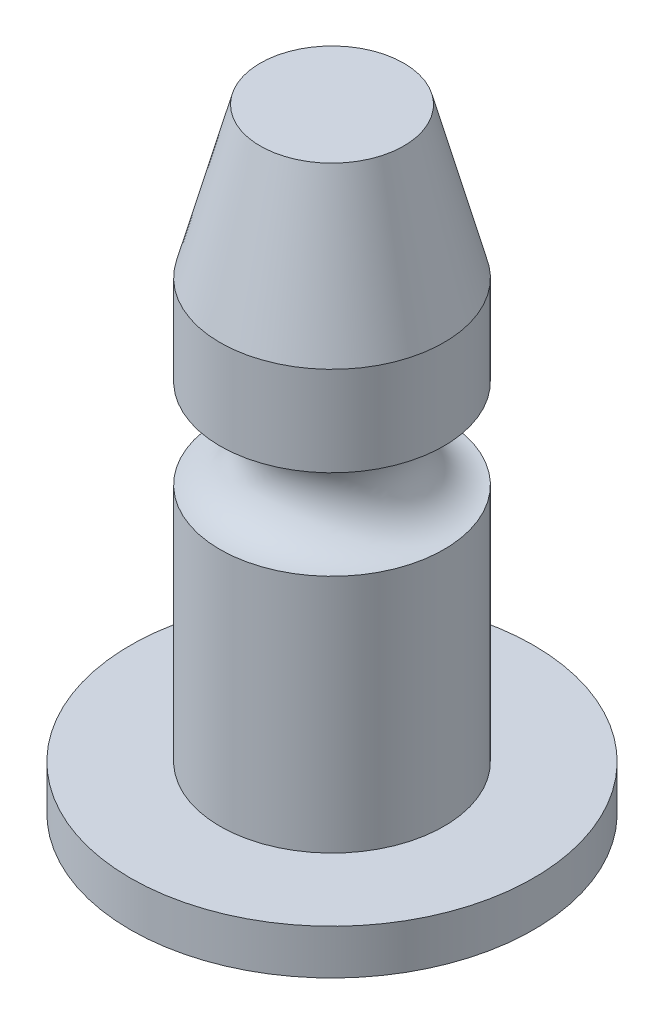
ISO-10303-21;
HEADER;
FILE_DESCRIPTION(('STEP AP214'),'2;1');
FILE_NAME('part.step','',(''),(''),'','','');
FILE_SCHEMA(('AUTOMOTIVE_DESIGN { 1 0 10303 214 1 1 1 1 }'));
ENDSEC;
DATA;
#1=APPLICATION_CONTEXT('core data for automotive mechanical design processes');
#2=APPLICATION_PROTOCOL_DEFINITION('international standard','automotive_design',2000,#1);
#3=PRODUCT_CONTEXT('',#1,'mechanical');
#4=PRODUCT('Part','Part','',(#3));
#5=PRODUCT_RELATED_PRODUCT_CATEGORY('part','',(#4));
#6=PRODUCT_DEFINITION_FORMATION('','',#4);
#7=PRODUCT_DEFINITION_CONTEXT('part definition',#1,'design');
#8=PRODUCT_DEFINITION('design','',#6,#7);
#9=PRODUCT_DEFINITION_SHAPE('','',#8);
#10=(LENGTH_UNIT() NAMED_UNIT(*) SI_UNIT(.MILLI.,.METRE.));
#11=(NAMED_UNIT(*) PLANE_ANGLE_UNIT() SI_UNIT($,.RADIAN.));
#12=(NAMED_UNIT(*) SI_UNIT($,.STERADIAN.) SOLID_ANGLE_UNIT());
#13=UNCERTAINTY_MEASURE_WITH_UNIT(LENGTH_MEASURE(1.E-05),#10,'distance_accuracy_value','');
#14=(GEOMETRIC_REPRESENTATION_CONTEXT(3) GLOBAL_UNCERTAINTY_ASSIGNED_CONTEXT((#13)) GLOBAL_UNIT_ASSIGNED_CONTEXT((#10,
#11,#12)) REPRESENTATION_CONTEXT('',''));
#15=CARTESIAN_POINT('',(0.,0.,0.));
#16=DIRECTION('',(0.,0.,1.));
#17=DIRECTION('',(1.,0.,0.));
#18=AXIS2_PLACEMENT_3D('',#15,#16,#17);
#19=CARTESIAN_POINT('',(-4.5,-7.35,0.));
#20=DIRECTION('',(0.,1.,0.));
#21=DIRECTION('',(0.,0.,1.));
#22=AXIS2_PLACEMENT_3D('',#19,#20,#21);
#23=PLANE('',#22);
#24=CARTESIAN_POINT('',(0.,-7.35,0.));
#25=DIRECTION('',(0.,-1.,0.));
#26=DIRECTION('',(0.,0.,-1.));
#27=AXIS2_PLACEMENT_3D('',#24,#25,#26);
#28=CIRCLE('',#27,4.5);
#29=CARTESIAN_POINT('',(0.,-7.35,-4.5));
#30=VERTEX_POINT('',#29);
#31=EDGE_CURVE('E10',#30,#30,#28,.T.);
#32=ORIENTED_EDGE('',*,*,#31,.T.);
#33=EDGE_LOOP('',(#32));
#34=FACE_BOUND('',#33,.T.);
#35=ADVANCED_FACE('F37',(#34),#23,.F.);
#36=CARTESIAN_POINT('',(0.,0.,0.));
#37=DIRECTION('',(0.,-1.,0.));
#38=DIRECTION('',(0.,0.,-1.));
#39=AXIS2_PLACEMENT_3D('',#36,#37,#38);
#40=CYLINDRICAL_SURFACE('',#39,4.5);
#41=ORIENTED_EDGE('',*,*,#31,.F.);
#42=EDGE_LOOP('',(#41));
#43=FACE_BOUND('',#42,.T.);
#44=CARTESIAN_POINT('',(0.,-6.35,0.));
#45=DIRECTION('',(0.,-1.,0.));
#46=DIRECTION('',(0.,0.,-1.));
#47=AXIS2_PLACEMENT_3D('',#44,#45,#46);
#48=CIRCLE('',#47,4.5);
#49=CARTESIAN_POINT('',(0.,-6.35,-4.5));
#50=VERTEX_POINT('',#49);
#51=EDGE_CURVE('E43',#50,#50,#48,.T.);
#52=ORIENTED_EDGE('',*,*,#51,.T.);
#53=EDGE_LOOP('',(#52));
#54=FACE_BOUND('',#53,.T.);
#55=ADVANCED_FACE('F78',(#43,#54),#40,.T.);
#56=CARTESIAN_POINT('',(-2.5,-6.35,0.));
#57=DIRECTION('',(0.,-1.,0.));
#58=DIRECTION('',(0.,0.,-1.));
#59=AXIS2_PLACEMENT_3D('',#56,#57,#58);
#60=PLANE('',#59);
#61=ORIENTED_EDGE('',*,*,#51,.F.);
#62=EDGE_LOOP('',(#61));
#63=FACE_BOUND('',#62,.T.);
#64=CARTESIAN_POINT('',(0.,-6.35,0.));
#65=DIRECTION('',(0.,-1.,0.));
#66=DIRECTION('',(0.,0.,-1.));
#67=AXIS2_PLACEMENT_3D('',#64,#65,#66);
#68=CIRCLE('',#67,2.5);
#69=CARTESIAN_POINT('',(0.,-6.35,-2.5));
#70=VERTEX_POINT('',#69);
#71=EDGE_CURVE('E47',#70,#70,#68,.T.);
#72=ORIENTED_EDGE('',*,*,#71,.T.);
#73=EDGE_LOOP('',(#72));
#74=FACE_BOUND('',#73,.T.);
#75=ADVANCED_FACE('F82',(#63,#74),#60,.F.);
#76=CARTESIAN_POINT('',(0.,0.,0.));
#77=DIRECTION('',(0.,-1.,0.));
#78=DIRECTION('',(0.,0.,-1.));
#79=AXIS2_PLACEMENT_3D('',#76,#77,#78);
#80=CYLINDRICAL_SURFACE('',#79,2.5);
#81=ORIENTED_EDGE('',*,*,#71,.F.);
#82=EDGE_LOOP('',(#81));
#83=FACE_BOUND('',#82,.T.);
#84=CARTESIAN_POINT('',(0.,-1.,0.));
#85=DIRECTION('',(0.,-1.,0.));
#86=DIRECTION('',(0.,0.,-1.));
#87=AXIS2_PLACEMENT_3D('',#84,#85,#86);
#88=CIRCLE('',#87,2.5);
#89=CARTESIAN_POINT('',(0.,-1.,-2.5));
#90=VERTEX_POINT('',#89);
#91=EDGE_CURVE('E51',#90,#90,#88,.T.);
#92=ORIENTED_EDGE('',*,*,#91,.T.);
#93=EDGE_LOOP('',(#92));
#94=FACE_BOUND('',#93,.T.);
#95=ADVANCED_FACE('F87',(#83,#94),#80,.T.);
#96=CARTESIAN_POINT('',(0.,0.,0.));
#97=DIRECTION('',(0.,-1.,0.));
#98=DIRECTION('',(0.,0.,-1.));
#99=AXIS2_PLACEMENT_3D('',#96,#97,#98);
#100=TOROIDAL_SURFACE('',#99,2.5,1.);
#101=ORIENTED_EDGE('',*,*,#91,.F.);
#102=EDGE_LOOP('',(#101));
#103=FACE_BOUND('',#102,.T.);
#104=CARTESIAN_POINT('',(0.,1.,0.));
#105=DIRECTION('',(0.,-1.,0.));
#106=DIRECTION('',(0.,0.,-1.));
#107=AXIS2_PLACEMENT_3D('',#104,#105,#106);
#108=CIRCLE('',#107,2.5);
#109=CARTESIAN_POINT('',(0.,1.,-2.5));
#110=VERTEX_POINT('',#109);
#111=EDGE_CURVE('E56',#110,#110,#108,.T.);
#112=ORIENTED_EDGE('',*,*,#111,.T.);
#113=EDGE_LOOP('',(#112));
#114=FACE_BOUND('',#113,.T.);
#115=ADVANCED_FACE('F93',(#103,#114),#100,.F.);
#116=CARTESIAN_POINT('',(0.,0.,0.));
#117=DIRECTION('',(0.,-1.,0.));
#118=DIRECTION('',(0.,0.,-1.));
#119=AXIS2_PLACEMENT_3D('',#116,#117,#118);
#120=CYLINDRICAL_SURFACE('',#119,2.5);
#121=ORIENTED_EDGE('',*,*,#111,.F.);
#122=EDGE_LOOP('',(#121));
#123=FACE_BOUND('',#122,.T.);
#124=CARTESIAN_POINT('',(0.,3.,0.));
#125=DIRECTION('',(0.,-1.,0.));
#126=DIRECTION('',(0.,0.,-1.));
#127=AXIS2_PLACEMENT_3D('',#124,#125,#126);
#128=CIRCLE('',#127,2.5);
#129=CARTESIAN_POINT('',(0.,3.,-2.5));
#130=VERTEX_POINT('',#129);
#131=EDGE_CURVE('E59',#130,#130,#128,.T.);
#132=ORIENTED_EDGE('',*,*,#131,.T.);
#133=EDGE_LOOP('',(#132));
#134=FACE_BOUND('',#133,.T.);
#135=ADVANCED_FACE('F74',(#123,#134),#120,.T.);
#136=CARTESIAN_POINT('',(0.,6.35,0.));
#137=DIRECTION('',(0.,-1.,0.));
#138=DIRECTION('',(0.,0.,-1.));
#139=AXIS2_PLACEMENT_3D('',#136,#137,#138);
#140=CONICAL_SURFACE('',#139,1.60237020535574,0.26179938779915);
#141=ORIENTED_EDGE('',*,*,#131,.F.);
#142=EDGE_LOOP('',(#141));
#143=FACE_BOUND('',#142,.T.);
#144=CARTESIAN_POINT('',(0.,6.35,0.));
#145=DIRECTION('',(0.,-1.,0.));
#146=DIRECTION('',(0.,0.,-1.));
#147=AXIS2_PLACEMENT_3D('',#144,#145,#146);
#148=CIRCLE('',#147,1.60237020535574);
#149=CARTESIAN_POINT('',(0.,6.35,-1.60237020535574));
#150=VERTEX_POINT('',#149);
#151=EDGE_CURVE('E62',#150,#150,#148,.T.);
#152=ORIENTED_EDGE('',*,*,#151,.T.);
#153=EDGE_LOOP('',(#152));
#154=FACE_BOUND('',#153,.T.);
#155=ADVANCED_FACE('F66',(#143,#154),#140,.T.);
#156=CARTESIAN_POINT('',(0.,6.35,0.));
#157=DIRECTION('',(0.,-1.,0.));
#158=DIRECTION('',(0.,0.,-1.));
#159=AXIS2_PLACEMENT_3D('',#156,#157,#158);
#160=PLANE('',#159);
#161=ORIENTED_EDGE('',*,*,#151,.F.);
#162=EDGE_LOOP('',(#161));
#163=FACE_BOUND('',#162,.T.);
#164=ADVANCED_FACE('F68',(#163),#160,.F.);
#165=CLOSED_SHELL('',(#35,#55,#75,#95,#115,#135,#155,#164));
#166=MANIFOLD_SOLID_BREP('B2',#165);
#167=ADVANCED_BREP_SHAPE_REPRESENTATION('',(#18,#166),#14);
#168=SHAPE_DEFINITION_REPRESENTATION(#9,#167);
ENDSEC;
END-ISO-10303-21;
